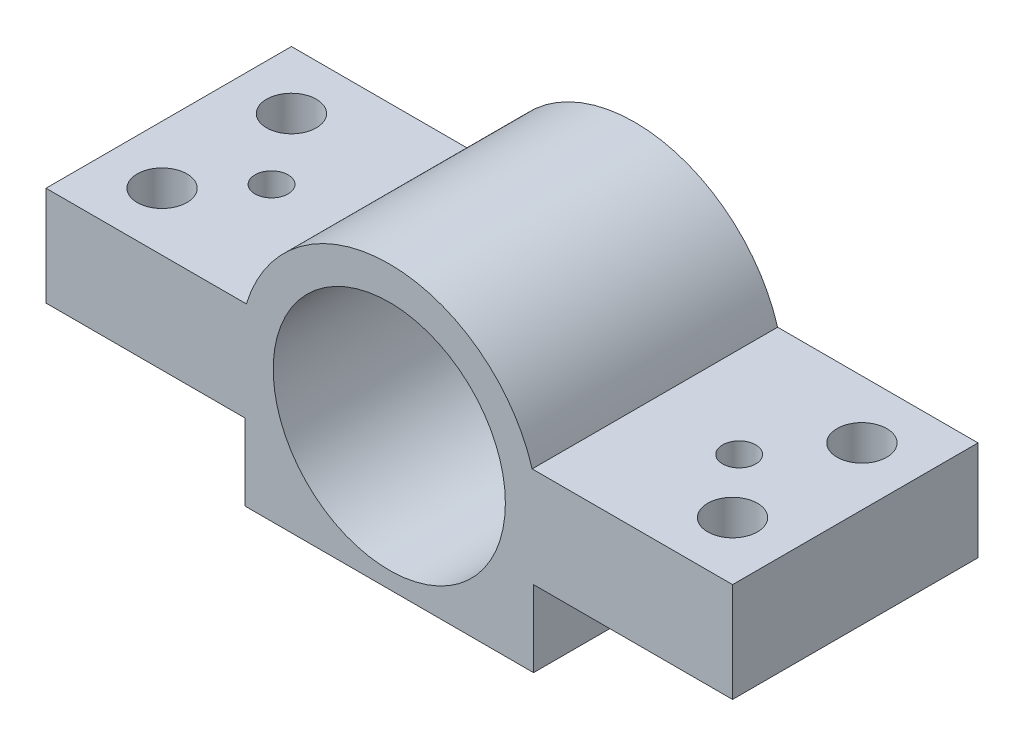
ISO-10303-21;
HEADER;
FILE_DESCRIPTION(('STEP AP214'),'2;1');
FILE_NAME('part.step','',(''),(''),'','','');
FILE_SCHEMA(('AUTOMOTIVE_DESIGN { 1 0 10303 214 1 1 1 1 }'));
ENDSEC;
DATA;
#1=APPLICATION_CONTEXT('core data for automotive mechanical design processes');
#2=APPLICATION_PROTOCOL_DEFINITION('international standard','automotive_design',2000,#1);
#3=PRODUCT_CONTEXT('',#1,'mechanical');
#4=PRODUCT('Part','Part','',(#3));
#5=PRODUCT_RELATED_PRODUCT_CATEGORY('part','',(#4));
#6=PRODUCT_DEFINITION_FORMATION('','',#4);
#7=PRODUCT_DEFINITION_CONTEXT('part definition',#1,'design');
#8=PRODUCT_DEFINITION('design','',#6,#7);
#9=PRODUCT_DEFINITION_SHAPE('','',#8);
#10=(LENGTH_UNIT() NAMED_UNIT(*) SI_UNIT(.MILLI.,.METRE.));
#11=(NAMED_UNIT(*) PLANE_ANGLE_UNIT() SI_UNIT($,.RADIAN.));
#12=(NAMED_UNIT(*) SI_UNIT($,.STERADIAN.) SOLID_ANGLE_UNIT());
#13=UNCERTAINTY_MEASURE_WITH_UNIT(LENGTH_MEASURE(1.E-05),#10,'distance_accuracy_value','');
#14=(GEOMETRIC_REPRESENTATION_CONTEXT(3) GLOBAL_UNCERTAINTY_ASSIGNED_CONTEXT((#13)) GLOBAL_UNIT_ASSIGNED_CONTEXT((#10,
#11,#12)) REPRESENTATION_CONTEXT('',''));
#15=CARTESIAN_POINT('',(0.,0.,0.));
#16=DIRECTION('',(0.,0.,1.));
#17=DIRECTION('',(1.,0.,0.));
#18=AXIS2_PLACEMENT_3D('',#15,#16,#17);
#19=CARTESIAN_POINT('',(0.,40.,74.));
#20=DIRECTION('',(0.,0.,1.));
#21=DIRECTION('',(1.,0.,0.));
#22=AXIS2_PLACEMENT_3D('',#19,#20,#21);
#23=PLANE('',#22);
#24=DIRECTION('',(0.,1.,0.));
#25=VECTOR('',#24,1.);
#26=CARTESIAN_POINT('',(43.5,0.,74.));
#27=LINE('',#26,#25);
#28=CARTESIAN_POINT('',(43.5,0.,74.));
#29=VERTEX_POINT('',#28);
#30=CARTESIAN_POINT('',(43.5,23.,74.));
#31=VERTEX_POINT('',#30);
#32=EDGE_CURVE('E168',#29,#31,#27,.T.);
#33=ORIENTED_EDGE('',*,*,#32,.T.);
#34=DIRECTION('',(1.,0.,0.));
#35=VECTOR('',#34,1.);
#36=CARTESIAN_POINT('',(43.5,23.,74.));
#37=LINE('',#36,#35);
#38=CARTESIAN_POINT('',(103.5,23.,74.));
#39=VERTEX_POINT('',#38);
#40=EDGE_CURVE('E106',#31,#39,#37,.T.);
#41=ORIENTED_EDGE('',*,*,#40,.T.);
#42=DIRECTION('',(0.,1.,0.));
#43=VECTOR('',#42,1.);
#44=CARTESIAN_POINT('',(103.5,23.,74.));
#45=LINE('',#44,#43);
#46=CARTESIAN_POINT('',(103.5,53.,74.));
#47=VERTEX_POINT('',#46);
#48=EDGE_CURVE('E217',#39,#47,#45,.T.);
#49=ORIENTED_EDGE('',*,*,#48,.T.);
#50=DIRECTION('',(-1.,0.,0.));
#51=VECTOR('',#50,1.);
#52=CARTESIAN_POINT('',(103.5,53.,74.));
#53=LINE('',#52,#51);
#54=CARTESIAN_POINT('',(43.081318457076,53.,74.));
#55=VERTEX_POINT('',#54);
#56=EDGE_CURVE('E219',#47,#55,#53,.T.);
#57=ORIENTED_EDGE('',*,*,#56,.T.);
#58=CARTESIAN_POINT('',(0.,40.,74.));
#59=DIRECTION('',(0.,0.,1.));
#60=DIRECTION('',(1.,0.,0.));
#61=AXIS2_PLACEMENT_3D('',#58,#59,#60);
#62=CIRCLE('',#61,45.);
#63=CARTESIAN_POINT('',(-43.081318457076,53.,74.));
#64=VERTEX_POINT('',#63);
#65=EDGE_CURVE('E221',#55,#64,#62,.T.);
#66=ORIENTED_EDGE('',*,*,#65,.T.);
#67=DIRECTION('',(-1.,0.,0.));
#68=VECTOR('',#67,1.);
#69=CARTESIAN_POINT('',(-103.5,53.,74.));
#70=LINE('',#69,#68);
#71=CARTESIAN_POINT('',(-103.5,53.,74.));
#72=VERTEX_POINT('',#71);
#73=EDGE_CURVE('E223',#64,#72,#70,.T.);
#74=ORIENTED_EDGE('',*,*,#73,.T.);
#75=DIRECTION('',(0.,-1.,0.));
#76=VECTOR('',#75,1.);
#77=CARTESIAN_POINT('',(-103.5,23.,74.));
#78=LINE('',#77,#76);
#79=CARTESIAN_POINT('',(-103.5,23.,74.));
#80=VERTEX_POINT('',#79);
#81=EDGE_CURVE('E131',#72,#80,#78,.T.);
#82=ORIENTED_EDGE('',*,*,#81,.T.);
#83=DIRECTION('',(1.,0.,0.));
#84=VECTOR('',#83,1.);
#85=CARTESIAN_POINT('',(-43.5,23.,74.));
#86=LINE('',#85,#84);
#87=CARTESIAN_POINT('',(-43.5,23.,74.));
#88=VERTEX_POINT('',#87);
#89=EDGE_CURVE('E125',#80,#88,#86,.T.);
#90=ORIENTED_EDGE('',*,*,#89,.T.);
#91=DIRECTION('',(0.,-1.,0.));
#92=VECTOR('',#91,1.);
#93=CARTESIAN_POINT('',(-43.5,0.,74.));
#94=LINE('',#93,#92);
#95=CARTESIAN_POINT('',(-43.5,0.,74.));
#96=VERTEX_POINT('',#95);
#97=EDGE_CURVE('E129',#88,#96,#94,.T.);
#98=ORIENTED_EDGE('',*,*,#97,.T.);
#99=DIRECTION('',(1.,0.,0.));
#100=VECTOR('',#99,1.);
#101=CARTESIAN_POINT('',(-43.5,0.,74.));
#102=LINE('',#101,#100);
#103=EDGE_CURVE('E57',#96,#29,#102,.T.);
#104=ORIENTED_EDGE('',*,*,#103,.T.);
#105=EDGE_LOOP('',(#33,#41,#49,#57,#66,#74,#82,#90,#98,#104));
#106=FACE_BOUND('',#105,.T.);
#107=CARTESIAN_POINT('',(0.,40.,74.));
#108=DIRECTION('',(0.,0.,1.));
#109=DIRECTION('',(1.,0.,0.));
#110=AXIS2_PLACEMENT_3D('',#107,#108,#109);
#111=CIRCLE('',#110,35.);
#112=CARTESIAN_POINT('',(35.,40.,74.));
#113=VERTEX_POINT('',#112);
#114=EDGE_CURVE('E153',#113,#113,#111,.T.);
#115=ORIENTED_EDGE('',*,*,#114,.F.);
#116=EDGE_LOOP('',(#115));
#117=FACE_BOUND('',#116,.T.);
#118=ADVANCED_FACE('F38',(#106,#117),#23,.T.);
#119=CARTESIAN_POINT('',(0.,40.,0.));
#120=DIRECTION('',(0.,0.,1.));
#121=DIRECTION('',(1.,0.,0.));
#122=AXIS2_PLACEMENT_3D('',#119,#120,#121);
#123=PLANE('',#122);
#124=DIRECTION('',(0.,1.,0.));
#125=VECTOR('',#124,1.);
#126=CARTESIAN_POINT('',(43.5,0.,0.));
#127=LINE('',#126,#125);
#128=CARTESIAN_POINT('',(43.5,0.,0.));
#129=VERTEX_POINT('',#128);
#130=CARTESIAN_POINT('',(43.5,23.,0.));
#131=VERTEX_POINT('',#130);
#132=EDGE_CURVE('E149',#129,#131,#127,.T.);
#133=ORIENTED_EDGE('',*,*,#132,.F.);
#134=DIRECTION('',(1.,0.,0.));
#135=VECTOR('',#134,1.);
#136=CARTESIAN_POINT('',(-43.5,0.,0.));
#137=LINE('',#136,#135);
#138=CARTESIAN_POINT('',(-43.5,0.,0.));
#139=VERTEX_POINT('',#138);
#140=EDGE_CURVE('E98',#139,#129,#137,.T.);
#141=ORIENTED_EDGE('',*,*,#140,.F.);
#142=DIRECTION('',(0.,-1.,0.));
#143=VECTOR('',#142,1.);
#144=CARTESIAN_POINT('',(-43.5,0.,0.));
#145=LINE('',#144,#143);
#146=CARTESIAN_POINT('',(-43.5,23.,0.));
#147=VERTEX_POINT('',#146);
#148=EDGE_CURVE('E92',#147,#139,#145,.T.);
#149=ORIENTED_EDGE('',*,*,#148,.F.);
#150=DIRECTION('',(1.,0.,0.));
#151=VECTOR('',#150,1.);
#152=CARTESIAN_POINT('',(-43.5,23.,0.));
#153=LINE('',#152,#151);
#154=CARTESIAN_POINT('',(-103.5,23.,0.));
#155=VERTEX_POINT('',#154);
#156=EDGE_CURVE('E139',#155,#147,#153,.T.);
#157=ORIENTED_EDGE('',*,*,#156,.F.);
#158=DIRECTION('',(0.,-1.,0.));
#159=VECTOR('',#158,1.);
#160=CARTESIAN_POINT('',(-103.5,23.,0.));
#161=LINE('',#160,#159);
#162=CARTESIAN_POINT('',(-103.5,53.,0.));
#163=VERTEX_POINT('',#162);
#164=EDGE_CURVE('E163',#163,#155,#161,.T.);
#165=ORIENTED_EDGE('',*,*,#164,.F.);
#166=DIRECTION('',(-1.,0.,0.));
#167=VECTOR('',#166,1.);
#168=CARTESIAN_POINT('',(-103.5,53.,0.));
#169=LINE('',#168,#167);
#170=CARTESIAN_POINT('',(-43.081318457076,53.,0.));
#171=VERTEX_POINT('',#170);
#172=EDGE_CURVE('E161',#171,#163,#169,.T.);
#173=ORIENTED_EDGE('',*,*,#172,.F.);
#174=CARTESIAN_POINT('',(0.,40.,0.));
#175=DIRECTION('',(0.,0.,1.));
#176=DIRECTION('',(1.,0.,0.));
#177=AXIS2_PLACEMENT_3D('',#174,#175,#176);
#178=CIRCLE('',#177,45.);
#179=CARTESIAN_POINT('',(43.081318457076,53.,0.));
#180=VERTEX_POINT('',#179);
#181=EDGE_CURVE('E159',#180,#171,#178,.T.);
#182=ORIENTED_EDGE('',*,*,#181,.F.);
#183=DIRECTION('',(-1.,0.,0.));
#184=VECTOR('',#183,1.);
#185=CARTESIAN_POINT('',(103.5,53.,0.));
#186=LINE('',#185,#184);
#187=CARTESIAN_POINT('',(103.5,53.,0.));
#188=VERTEX_POINT('',#187);
#189=EDGE_CURVE('E157',#188,#180,#186,.T.);
#190=ORIENTED_EDGE('',*,*,#189,.F.);
#191=DIRECTION('',(0.,1.,0.));
#192=VECTOR('',#191,1.);
#193=CARTESIAN_POINT('',(103.5,23.,0.));
#194=LINE('',#193,#192);
#195=CARTESIAN_POINT('',(103.5,23.,0.));
#196=VERTEX_POINT('',#195);
#197=EDGE_CURVE('E155',#196,#188,#194,.T.);
#198=ORIENTED_EDGE('',*,*,#197,.F.);
#199=DIRECTION('',(1.,0.,0.));
#200=VECTOR('',#199,1.);
#201=CARTESIAN_POINT('',(43.5,23.,0.));
#202=LINE('',#201,#200);
#203=EDGE_CURVE('E152',#131,#196,#202,.T.);
#204=ORIENTED_EDGE('',*,*,#203,.F.);
#205=EDGE_LOOP('',(#133,#141,#149,#157,#165,#173,#182,#190,#198,#204));
#206=FACE_BOUND('',#205,.T.);
#207=CARTESIAN_POINT('',(0.,40.,0.));
#208=DIRECTION('',(0.,0.,1.));
#209=DIRECTION('',(1.,0.,0.));
#210=AXIS2_PLACEMENT_3D('',#207,#208,#209);
#211=CIRCLE('',#210,35.);
#212=CARTESIAN_POINT('',(35.,40.,0.));
#213=VERTEX_POINT('',#212);
#214=EDGE_CURVE('E210',#213,#213,#211,.T.);
#215=ORIENTED_EDGE('',*,*,#214,.T.);
#216=EDGE_LOOP('',(#215));
#217=FACE_BOUND('',#216,.T.);
#218=ADVANCED_FACE('F236',(#206,#217),#123,.F.);
#219=CARTESIAN_POINT('',(43.5,0.,74.));
#220=DIRECTION('',(-1.,0.,0.));
#221=DIRECTION('',(0.,0.,1.));
#222=AXIS2_PLACEMENT_3D('',#219,#220,#221);
#223=PLANE('',#222);
#224=ORIENTED_EDGE('',*,*,#132,.T.);
#225=DIRECTION('',(0.,0.,-1.));
#226=VECTOR('',#225,1.);
#227=CARTESIAN_POINT('',(43.5,23.,74.));
#228=LINE('',#227,#226);
#229=EDGE_CURVE('E11',#31,#131,#228,.T.);
#230=ORIENTED_EDGE('',*,*,#229,.F.);
#231=ORIENTED_EDGE('',*,*,#32,.F.);
#232=DIRECTION('',(0.,0.,-1.));
#233=VECTOR('',#232,1.);
#234=CARTESIAN_POINT('',(43.5,0.,74.));
#235=LINE('',#234,#233);
#236=EDGE_CURVE('E145',#29,#129,#235,.T.);
#237=ORIENTED_EDGE('',*,*,#236,.T.);
#238=EDGE_LOOP('',(#224,#230,#231,#237));
#239=FACE_BOUND('',#238,.T.);
#240=ADVANCED_FACE('F40',(#239),#223,.F.);
#241=CARTESIAN_POINT('',(43.5,23.,74.));
#242=DIRECTION('',(0.,1.,0.));
#243=DIRECTION('',(0.,0.,1.));
#244=AXIS2_PLACEMENT_3D('',#241,#242,#243);
#245=PLANE('',#244);
#246=CARTESIAN_POINT('',(86.,23.,56.5));
#247=DIRECTION('',(0.,1.,0.));
#248=DIRECTION('',(0.,0.,1.));
#249=AXIS2_PLACEMENT_3D('',#246,#247,#248);
#250=CIRCLE('',#249,7.50000000000001);
#251=CARTESIAN_POINT('',(86.,23.,64.));
#252=VERTEX_POINT('',#251);
#253=EDGE_CURVE('E203',#252,#252,#250,.T.);
#254=ORIENTED_EDGE('',*,*,#253,.T.);
#255=EDGE_LOOP('',(#254));
#256=FACE_BOUND('',#255,.T.);
#257=CARTESIAN_POINT('',(70.5,23.,39.));
#258=DIRECTION('',(0.,1.,0.));
#259=DIRECTION('',(0.,0.,1.));
#260=AXIS2_PLACEMENT_3D('',#257,#258,#259);
#261=CIRCLE('',#260,5.00000000000001);
#262=CARTESIAN_POINT('',(70.5,23.,44.));
#263=VERTEX_POINT('',#262);
#264=EDGE_CURVE('E198',#263,#263,#261,.T.);
#265=ORIENTED_EDGE('',*,*,#264,.T.);
#266=EDGE_LOOP('',(#265));
#267=FACE_BOUND('',#266,.T.);
#268=CARTESIAN_POINT('',(86.,23.,17.5));
#269=DIRECTION('',(0.,1.,0.));
#270=DIRECTION('',(0.,0.,1.));
#271=AXIS2_PLACEMENT_3D('',#268,#269,#270);
#272=CIRCLE('',#271,7.50000000000001);
#273=CARTESIAN_POINT('',(86.,23.,25.));
#274=VERTEX_POINT('',#273);
#275=EDGE_CURVE('E194',#274,#274,#272,.T.);
#276=ORIENTED_EDGE('',*,*,#275,.T.);
#277=EDGE_LOOP('',(#276));
#278=FACE_BOUND('',#277,.T.);
#279=ORIENTED_EDGE('',*,*,#203,.T.);
#280=DIRECTION('',(0.,0.,-1.));
#281=VECTOR('',#280,1.);
#282=CARTESIAN_POINT('',(103.5,23.,74.));
#283=LINE('',#282,#281);
#284=EDGE_CURVE('E48',#39,#196,#283,.T.);
#285=ORIENTED_EDGE('',*,*,#284,.F.);
#286=ORIENTED_EDGE('',*,*,#40,.F.);
#287=ORIENTED_EDGE('',*,*,#229,.T.);
#288=EDGE_LOOP('',(#279,#285,#286,#287));
#289=FACE_BOUND('',#288,.T.);
#290=ADVANCED_FACE('F311',(#256,#267,#278,#289),#245,.F.);
#291=CARTESIAN_POINT('',(103.5,23.,74.));
#292=DIRECTION('',(-1.,0.,0.));
#293=DIRECTION('',(0.,0.,1.));
#294=AXIS2_PLACEMENT_3D('',#291,#292,#293);
#295=PLANE('',#294);
#296=ORIENTED_EDGE('',*,*,#197,.T.);
#297=DIRECTION('',(0.,0.,-1.));
#298=VECTOR('',#297,1.);
#299=CARTESIAN_POINT('',(103.5,53.,74.));
#300=LINE('',#299,#298);
#301=EDGE_CURVE('E181',#47,#188,#300,.T.);
#302=ORIENTED_EDGE('',*,*,#301,.F.);
#303=ORIENTED_EDGE('',*,*,#48,.F.);
#304=ORIENTED_EDGE('',*,*,#284,.T.);
#305=EDGE_LOOP('',(#296,#302,#303,#304));
#306=FACE_BOUND('',#305,.T.);
#307=ADVANCED_FACE('F308',(#306),#295,.F.);
#308=CARTESIAN_POINT('',(103.5,53.,74.));
#309=DIRECTION('',(0.,-1.,0.));
#310=DIRECTION('',(0.,0.,-1.));
#311=AXIS2_PLACEMENT_3D('',#308,#309,#310);
#312=PLANE('',#311);
#313=CARTESIAN_POINT('',(86.,53.,56.5));
#314=DIRECTION('',(0.,1.,0.));
#315=DIRECTION('',(0.,0.,1.));
#316=AXIS2_PLACEMENT_3D('',#313,#314,#315);
#317=CIRCLE('',#316,7.50000000000001);
#318=CARTESIAN_POINT('',(86.,53.,64.));
#319=VERTEX_POINT('',#318);
#320=EDGE_CURVE('E437',#319,#319,#317,.T.);
#321=ORIENTED_EDGE('',*,*,#320,.F.);
#322=EDGE_LOOP('',(#321));
#323=FACE_BOUND('',#322,.T.);
#324=CARTESIAN_POINT('',(70.5,53.,39.));
#325=DIRECTION('',(0.,1.,0.));
#326=DIRECTION('',(0.,0.,1.));
#327=AXIS2_PLACEMENT_3D('',#324,#325,#326);
#328=CIRCLE('',#327,5.00000000000001);
#329=CARTESIAN_POINT('',(70.5,53.,44.));
#330=VERTEX_POINT('',#329);
#331=EDGE_CURVE('E441',#330,#330,#328,.T.);
#332=ORIENTED_EDGE('',*,*,#331,.F.);
#333=EDGE_LOOP('',(#332));
#334=FACE_BOUND('',#333,.T.);
#335=CARTESIAN_POINT('',(86.,53.,17.5));
#336=DIRECTION('',(0.,1.,0.));
#337=DIRECTION('',(0.,0.,1.));
#338=AXIS2_PLACEMENT_3D('',#335,#336,#337);
#339=CIRCLE('',#338,7.50000000000001);
#340=CARTESIAN_POINT('',(86.,53.,25.));
#341=VERTEX_POINT('',#340);
#342=EDGE_CURVE('E189',#341,#341,#339,.T.);
#343=ORIENTED_EDGE('',*,*,#342,.F.);
#344=EDGE_LOOP('',(#343));
#345=FACE_BOUND('',#344,.T.);
#346=ORIENTED_EDGE('',*,*,#189,.T.);
#347=DIRECTION('',(0.,0.,-1.));
#348=VECTOR('',#347,1.);
#349=CARTESIAN_POINT('',(43.081318457076,53.,74.));
#350=LINE('',#349,#348);
#351=EDGE_CURVE('E178',#55,#180,#350,.T.);
#352=ORIENTED_EDGE('',*,*,#351,.F.);
#353=ORIENTED_EDGE('',*,*,#56,.F.);
#354=ORIENTED_EDGE('',*,*,#301,.T.);
#355=EDGE_LOOP('',(#346,#352,#353,#354));
#356=FACE_BOUND('',#355,.T.);
#357=ADVANCED_FACE('F304',(#323,#334,#345,#356),#312,.F.);
#358=CARTESIAN_POINT('',(0.,40.,74.));
#359=DIRECTION('',(0.,0.,-1.));
#360=DIRECTION('',(-1.,0.,0.));
#361=AXIS2_PLACEMENT_3D('',#358,#359,#360);
#362=CYLINDRICAL_SURFACE('',#361,45.);
#363=ORIENTED_EDGE('',*,*,#181,.T.);
#364=DIRECTION('',(0.,0.,-1.));
#365=VECTOR('',#364,1.);
#366=CARTESIAN_POINT('',(-43.081318457076,53.,74.));
#367=LINE('',#366,#365);
#368=EDGE_CURVE('E175',#64,#171,#367,.T.);
#369=ORIENTED_EDGE('',*,*,#368,.F.);
#370=ORIENTED_EDGE('',*,*,#65,.F.);
#371=ORIENTED_EDGE('',*,*,#351,.T.);
#372=EDGE_LOOP('',(#363,#369,#370,#371));
#373=FACE_BOUND('',#372,.T.);
#374=ADVANCED_FACE('F300',(#373),#362,.T.);
#375=CARTESIAN_POINT('',(-103.5,53.,74.));
#376=DIRECTION('',(0.,-1.,0.));
#377=DIRECTION('',(0.,0.,-1.));
#378=AXIS2_PLACEMENT_3D('',#375,#376,#377);
#379=PLANE('',#378);
#380=CARTESIAN_POINT('',(-86.,53.,17.5));
#381=DIRECTION('',(0.,1.,0.));
#382=DIRECTION('',(0.,0.,1.));
#383=AXIS2_PLACEMENT_3D('',#380,#381,#382);
#384=CIRCLE('',#383,7.50000000000001);
#385=CARTESIAN_POINT('',(-86.,53.,25.));
#386=VERTEX_POINT('',#385);
#387=EDGE_CURVE('E445',#386,#386,#384,.T.);
#388=ORIENTED_EDGE('',*,*,#387,.F.);
#389=EDGE_LOOP('',(#388));
#390=FACE_BOUND('',#389,.T.);
#391=CARTESIAN_POINT('',(-86.,53.,56.5));
#392=DIRECTION('',(0.,1.,0.));
#393=DIRECTION('',(0.,0.,1.));
#394=AXIS2_PLACEMENT_3D('',#391,#392,#393);
#395=CIRCLE('',#394,7.50000000000001);
#396=CARTESIAN_POINT('',(-86.,53.,64.));
#397=VERTEX_POINT('',#396);
#398=EDGE_CURVE('E450',#397,#397,#395,.T.);
#399=ORIENTED_EDGE('',*,*,#398,.F.);
#400=EDGE_LOOP('',(#399));
#401=FACE_BOUND('',#400,.T.);
#402=CARTESIAN_POINT('',(-70.5,53.,39.));
#403=DIRECTION('',(0.,1.,0.));
#404=DIRECTION('',(0.,0.,1.));
#405=AXIS2_PLACEMENT_3D('',#402,#403,#404);
#406=CIRCLE('',#405,4.99999999999999);
#407=CARTESIAN_POINT('',(-70.5,53.,44.));
#408=VERTEX_POINT('',#407);
#409=EDGE_CURVE('E288',#408,#408,#406,.T.);
#410=ORIENTED_EDGE('',*,*,#409,.F.);
#411=EDGE_LOOP('',(#410));
#412=FACE_BOUND('',#411,.T.);
#413=ORIENTED_EDGE('',*,*,#172,.T.);
#414=DIRECTION('',(0.,0.,-1.));
#415=VECTOR('',#414,1.);
#416=CARTESIAN_POINT('',(-103.5,53.,74.));
#417=LINE('',#416,#415);
#418=EDGE_CURVE('E172',#72,#163,#417,.T.);
#419=ORIENTED_EDGE('',*,*,#418,.F.);
#420=ORIENTED_EDGE('',*,*,#73,.F.);
#421=ORIENTED_EDGE('',*,*,#368,.T.);
#422=EDGE_LOOP('',(#413,#419,#420,#421));
#423=FACE_BOUND('',#422,.T.);
#424=ADVANCED_FACE('F229',(#390,#401,#412,#423),#379,.F.);
#425=CARTESIAN_POINT('',(-103.5,23.,74.));
#426=DIRECTION('',(1.,0.,0.));
#427=DIRECTION('',(0.,0.,-1.));
#428=AXIS2_PLACEMENT_3D('',#425,#426,#427);
#429=PLANE('',#428);
#430=ORIENTED_EDGE('',*,*,#164,.T.);
#431=DIRECTION('',(0.,0.,-1.));
#432=VECTOR('',#431,1.);
#433=CARTESIAN_POINT('',(-103.5,23.,74.));
#434=LINE('',#433,#432);
#435=EDGE_CURVE('E140',#80,#155,#434,.T.);
#436=ORIENTED_EDGE('',*,*,#435,.F.);
#437=ORIENTED_EDGE('',*,*,#81,.F.);
#438=ORIENTED_EDGE('',*,*,#418,.T.);
#439=EDGE_LOOP('',(#430,#436,#437,#438));
#440=FACE_BOUND('',#439,.T.);
#441=ADVANCED_FACE('F233',(#440),#429,.F.);
#442=CARTESIAN_POINT('',(-43.5,23.,74.));
#443=DIRECTION('',(0.,1.,0.));
#444=DIRECTION('',(-1.,0.,0.));
#445=AXIS2_PLACEMENT_3D('',#442,#443,#444);
#446=PLANE('',#445);
#447=CARTESIAN_POINT('',(-86.,23.,17.5));
#448=DIRECTION('',(0.,1.,0.));
#449=DIRECTION('',(-1.,0.,0.));
#450=AXIS2_PLACEMENT_3D('',#447,#448,#449);
#451=CIRCLE('',#450,7.50000000000001);
#452=CARTESIAN_POINT('',(-93.5,23.,17.5));
#453=VERTEX_POINT('',#452);
#454=EDGE_CURVE('E42',#453,#453,#451,.T.);
#455=ORIENTED_EDGE('',*,*,#454,.T.);
#456=EDGE_LOOP('',(#455));
#457=FACE_BOUND('',#456,.T.);
#458=CARTESIAN_POINT('',(-86.,23.,56.5));
#459=DIRECTION('',(0.,1.,0.));
#460=DIRECTION('',(-1.,0.,0.));
#461=AXIS2_PLACEMENT_3D('',#458,#459,#460);
#462=CIRCLE('',#461,7.50000000000001);
#463=CARTESIAN_POINT('',(-93.5,23.,56.5));
#464=VERTEX_POINT('',#463);
#465=EDGE_CURVE('E188',#464,#464,#462,.T.);
#466=ORIENTED_EDGE('',*,*,#465,.T.);
#467=EDGE_LOOP('',(#466));
#468=FACE_BOUND('',#467,.T.);
#469=CARTESIAN_POINT('',(-70.5,23.,39.));
#470=DIRECTION('',(0.,1.,0.));
#471=DIRECTION('',(-1.,0.,0.));
#472=AXIS2_PLACEMENT_3D('',#469,#470,#471);
#473=CIRCLE('',#472,4.99999999999999);
#474=CARTESIAN_POINT('',(-75.5,23.,39.));
#475=VERTEX_POINT('',#474);
#476=EDGE_CURVE('E186',#475,#475,#473,.T.);
#477=ORIENTED_EDGE('',*,*,#476,.T.);
#478=EDGE_LOOP('',(#477));
#479=FACE_BOUND('',#478,.T.);
#480=ORIENTED_EDGE('',*,*,#156,.T.);
#481=DIRECTION('',(0.,0.,-1.));
#482=VECTOR('',#481,1.);
#483=CARTESIAN_POINT('',(-43.5,23.,74.));
#484=LINE('',#483,#482);
#485=EDGE_CURVE('E136',#88,#147,#484,.T.);
#486=ORIENTED_EDGE('',*,*,#485,.F.);
#487=ORIENTED_EDGE('',*,*,#89,.F.);
#488=ORIENTED_EDGE('',*,*,#435,.T.);
#489=EDGE_LOOP('',(#480,#486,#487,#488));
#490=FACE_BOUND('',#489,.T.);
#491=ADVANCED_FACE('F137',(#457,#468,#479,#490),#446,.F.);
#492=CARTESIAN_POINT('',(-43.5,0.,74.));
#493=DIRECTION('',(1.,0.,0.));
#494=DIRECTION('',(0.,0.,-1.));
#495=AXIS2_PLACEMENT_3D('',#492,#493,#494);
#496=PLANE('',#495);
#497=ORIENTED_EDGE('',*,*,#148,.T.);
#498=DIRECTION('',(0.,0.,-1.));
#499=VECTOR('',#498,1.);
#500=CARTESIAN_POINT('',(-43.5,0.,74.));
#501=LINE('',#500,#499);
#502=EDGE_CURVE('E141',#96,#139,#501,.T.);
#503=ORIENTED_EDGE('',*,*,#502,.F.);
#504=ORIENTED_EDGE('',*,*,#97,.F.);
#505=ORIENTED_EDGE('',*,*,#485,.T.);
#506=EDGE_LOOP('',(#497,#503,#504,#505));
#507=FACE_BOUND('',#506,.T.);
#508=ADVANCED_FACE('F143',(#507),#496,.F.);
#509=CARTESIAN_POINT('',(-43.5,0.,74.));
#510=DIRECTION('',(0.,1.,0.));
#511=DIRECTION('',(-1.,0.,0.));
#512=AXIS2_PLACEMENT_3D('',#509,#510,#511);
#513=PLANE('',#512);
#514=ORIENTED_EDGE('',*,*,#140,.T.);
#515=ORIENTED_EDGE('',*,*,#236,.F.);
#516=ORIENTED_EDGE('',*,*,#103,.F.);
#517=ORIENTED_EDGE('',*,*,#502,.T.);
#518=EDGE_LOOP('',(#514,#515,#516,#517));
#519=FACE_BOUND('',#518,.T.);
#520=ADVANCED_FACE('F242',(#519),#513,.F.);
#521=CARTESIAN_POINT('',(0.,40.,74.));
#522=DIRECTION('',(0.,0.,-1.));
#523=DIRECTION('',(-1.,0.,0.));
#524=AXIS2_PLACEMENT_3D('',#521,#522,#523);
#525=CYLINDRICAL_SURFACE('',#524,35.);
#526=ORIENTED_EDGE('',*,*,#114,.T.);
#527=EDGE_LOOP('',(#526));
#528=FACE_BOUND('',#527,.T.);
#529=ORIENTED_EDGE('',*,*,#214,.F.);
#530=EDGE_LOOP('',(#529));
#531=FACE_BOUND('',#530,.T.);
#532=ADVANCED_FACE('F244',(#528,#531),#525,.F.);
#533=CARTESIAN_POINT('',(-70.5,0.,39.));
#534=DIRECTION('',(0.,1.,0.));
#535=DIRECTION('',(0.,0.,1.));
#536=AXIS2_PLACEMENT_3D('',#533,#534,#535);
#537=CYLINDRICAL_SURFACE('',#536,4.99999999999999);
#538=ORIENTED_EDGE('',*,*,#409,.T.);
#539=EDGE_LOOP('',(#538));
#540=FACE_BOUND('',#539,.T.);
#541=ORIENTED_EDGE('',*,*,#476,.F.);
#542=EDGE_LOOP('',(#541));
#543=FACE_BOUND('',#542,.T.);
#544=ADVANCED_FACE('F250',(#540,#543),#537,.F.);
#545=CARTESIAN_POINT('',(-86.,0.,56.5));
#546=DIRECTION('',(0.,1.,0.));
#547=DIRECTION('',(0.,0.,1.));
#548=AXIS2_PLACEMENT_3D('',#545,#546,#547);
#549=CYLINDRICAL_SURFACE('',#548,7.50000000000001);
#550=ORIENTED_EDGE('',*,*,#398,.T.);
#551=EDGE_LOOP('',(#550));
#552=FACE_BOUND('',#551,.T.);
#553=ORIENTED_EDGE('',*,*,#465,.F.);
#554=EDGE_LOOP('',(#553));
#555=FACE_BOUND('',#554,.T.);
#556=ADVANCED_FACE('F267',(#552,#555),#549,.F.);
#557=CARTESIAN_POINT('',(-86.,0.,17.5));
#558=DIRECTION('',(0.,1.,0.));
#559=DIRECTION('',(0.,0.,1.));
#560=AXIS2_PLACEMENT_3D('',#557,#558,#559);
#561=CYLINDRICAL_SURFACE('',#560,7.50000000000001);
#562=ORIENTED_EDGE('',*,*,#387,.T.);
#563=EDGE_LOOP('',(#562));
#564=FACE_BOUND('',#563,.T.);
#565=ORIENTED_EDGE('',*,*,#454,.F.);
#566=EDGE_LOOP('',(#565));
#567=FACE_BOUND('',#566,.T.);
#568=ADVANCED_FACE('F265',(#564,#567),#561,.F.);
#569=CARTESIAN_POINT('',(86.,0.,17.5));
#570=DIRECTION('',(0.,1.,0.));
#571=DIRECTION('',(0.,0.,1.));
#572=AXIS2_PLACEMENT_3D('',#569,#570,#571);
#573=CYLINDRICAL_SURFACE('',#572,7.50000000000001);
#574=ORIENTED_EDGE('',*,*,#342,.T.);
#575=EDGE_LOOP('',(#574));
#576=FACE_BOUND('',#575,.T.);
#577=ORIENTED_EDGE('',*,*,#275,.F.);
#578=EDGE_LOOP('',(#577));
#579=FACE_BOUND('',#578,.T.);
#580=ADVANCED_FACE('F261',(#576,#579),#573,.F.);
#581=CARTESIAN_POINT('',(70.5,0.,39.));
#582=DIRECTION('',(0.,1.,0.));
#583=DIRECTION('',(0.,0.,1.));
#584=AXIS2_PLACEMENT_3D('',#581,#582,#583);
#585=CYLINDRICAL_SURFACE('',#584,5.00000000000001);
#586=ORIENTED_EDGE('',*,*,#331,.T.);
#587=EDGE_LOOP('',(#586));
#588=FACE_BOUND('',#587,.T.);
#589=ORIENTED_EDGE('',*,*,#264,.F.);
#590=EDGE_LOOP('',(#589));
#591=FACE_BOUND('',#590,.T.);
#592=ADVANCED_FACE('F264',(#588,#591),#585,.F.);
#593=CARTESIAN_POINT('',(86.,0.,56.5));
#594=DIRECTION('',(0.,1.,0.));
#595=DIRECTION('',(0.,0.,1.));
#596=AXIS2_PLACEMENT_3D('',#593,#594,#595);
#597=CYLINDRICAL_SURFACE('',#596,7.50000000000001);
#598=ORIENTED_EDGE('',*,*,#320,.T.);
#599=EDGE_LOOP('',(#598));
#600=FACE_BOUND('',#599,.T.);
#601=ORIENTED_EDGE('',*,*,#253,.F.);
#602=EDGE_LOOP('',(#601));
#603=FACE_BOUND('',#602,.T.);
#604=ADVANCED_FACE('F276',(#600,#603),#597,.F.);
#605=CLOSED_SHELL('',(#118,#218,#240,#290,#307,#357,#374,#424,#441,#491,#508,#520,#532,#544,
#556,#568,#580,#592,#604));
#606=MANIFOLD_SOLID_BREP('B2',#605);
#607=ADVANCED_BREP_SHAPE_REPRESENTATION('',(#18,#606),#14);
#608=SHAPE_DEFINITION_REPRESENTATION(#9,#607);
ENDSEC;
END-ISO-10303-21;
